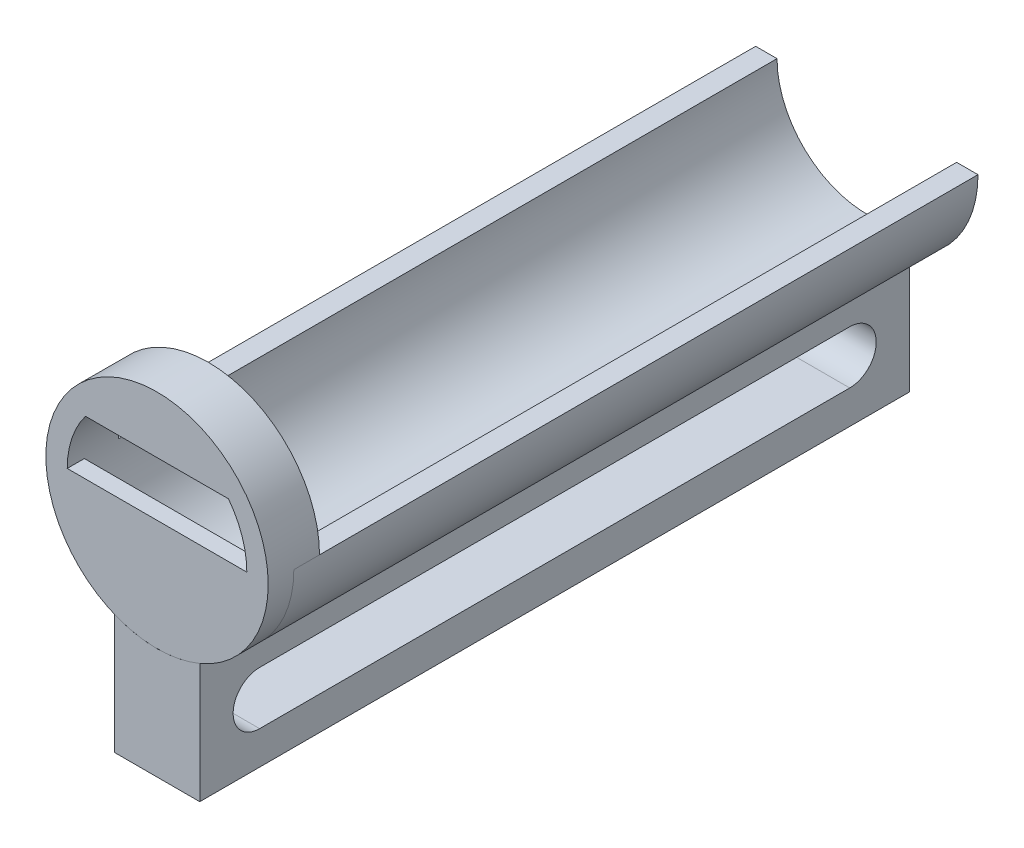
ISO-10303-21;
HEADER;
FILE_DESCRIPTION(('STEP AP214'),'2;1');
FILE_NAME('part.step','',(''),(''),'','','');
FILE_SCHEMA(('AUTOMOTIVE_DESIGN { 1 0 10303 214 1 1 1 1 }'));
ENDSEC;
DATA;
#1=APPLICATION_CONTEXT('core data for automotive mechanical design processes');
#2=APPLICATION_PROTOCOL_DEFINITION('international standard','automotive_design',2000,#1);
#3=PRODUCT_CONTEXT('',#1,'mechanical');
#4=PRODUCT('Part','Part','',(#3));
#5=PRODUCT_RELATED_PRODUCT_CATEGORY('part','',(#4));
#6=PRODUCT_DEFINITION_FORMATION('','',#4);
#7=PRODUCT_DEFINITION_CONTEXT('part definition',#1,'design');
#8=PRODUCT_DEFINITION('design','',#6,#7);
#9=PRODUCT_DEFINITION_SHAPE('','',#8);
#10=(LENGTH_UNIT() NAMED_UNIT(*) SI_UNIT(.MILLI.,.METRE.));
#11=(NAMED_UNIT(*) PLANE_ANGLE_UNIT() SI_UNIT($,.RADIAN.));
#12=(NAMED_UNIT(*) SI_UNIT($,.STERADIAN.) SOLID_ANGLE_UNIT());
#13=UNCERTAINTY_MEASURE_WITH_UNIT(LENGTH_MEASURE(1.E-05),#10,'distance_accuracy_value','');
#14=(GEOMETRIC_REPRESENTATION_CONTEXT(3) GLOBAL_UNCERTAINTY_ASSIGNED_CONTEXT((#13)) GLOBAL_UNIT_ASSIGNED_CONTEXT((#10,
#11,#12)) REPRESENTATION_CONTEXT('',''));
#15=CARTESIAN_POINT('',(0.,0.,0.));
#16=DIRECTION('',(0.,0.,1.));
#17=DIRECTION('',(1.,0.,0.));
#18=AXIS2_PLACEMENT_3D('',#15,#16,#17);
#19=CARTESIAN_POINT('',(8231.96943647304,2967.6134101707,3.));
#20=DIRECTION('',(-1.,0.,0.));
#21=DIRECTION('',(0.,0.,1.));
#22=AXIS2_PLACEMENT_3D('',#19,#20,#21);
#23=PLANE('',#22);
#24=CARTESIAN_POINT('',(8231.96943647304,2974.6134101707,-73.));
#25=DIRECTION('',(-1.,0.,0.));
#26=DIRECTION('',(0.,0.,1.));
#27=AXIS2_PLACEMENT_3D('',#24,#25,#26);
#28=CIRCLE('',#27,3.10000000000032);
#29=CARTESIAN_POINT('',(8231.96943647304,2977.7134101707,-73.));
#30=VERTEX_POINT('',#29);
#31=CARTESIAN_POINT('',(8231.96943647304,2971.5134101707,-73.));
#32=VERTEX_POINT('',#31);
#33=EDGE_CURVE('E80',#30,#32,#28,.T.);
#34=ORIENTED_EDGE('',*,*,#33,.F.);
#35=DIRECTION('',(0.,0.,-1.));
#36=VECTOR('',#35,1.);
#37=CARTESIAN_POINT('',(8231.96943647304,2977.7134101707,-73.));
#38=LINE('',#37,#36);
#39=CARTESIAN_POINT('',(8231.96943647304,2977.7134101707,-4.));
#40=VERTEX_POINT('',#39);
#41=EDGE_CURVE('E167',#40,#30,#38,.T.);
#42=ORIENTED_EDGE('',*,*,#41,.F.);
#43=CARTESIAN_POINT('',(8231.96943647304,2974.6134101707,-4.));
#44=DIRECTION('',(-1.,0.,0.));
#45=DIRECTION('',(0.,0.,1.));
#46=AXIS2_PLACEMENT_3D('',#43,#44,#45);
#47=CIRCLE('',#46,3.10000000000032);
#48=CARTESIAN_POINT('',(8231.96943647304,2971.5134101707,-4.));
#49=VERTEX_POINT('',#48);
#50=EDGE_CURVE('E178',#49,#40,#47,.T.);
#51=ORIENTED_EDGE('',*,*,#50,.F.);
#52=DIRECTION('',(0.,0.,1.));
#53=VECTOR('',#52,1.);
#54=CARTESIAN_POINT('',(8231.96943647304,2971.5134101707,-73.));
#55=LINE('',#54,#53);
#56=EDGE_CURVE('E215',#32,#49,#55,.T.);
#57=ORIENTED_EDGE('',*,*,#56,.F.);
#58=EDGE_LOOP('',(#34,#42,#51,#57));
#59=FACE_BOUND('',#58,.T.);
#60=DIRECTION('',(0.,1.,0.));
#61=VECTOR('',#60,1.);
#62=CARTESIAN_POINT('',(8231.96943647304,2967.6134101707,3.));
#63=LINE('',#62,#61);
#64=CARTESIAN_POINT('',(8231.96943647304,2967.6134101707,3.));
#65=VERTEX_POINT('',#64);
#66=CARTESIAN_POINT('',(8231.96943647304,2981.6134101707,3.));
#67=VERTEX_POINT('',#66);
#68=EDGE_CURVE('E140',#65,#67,#63,.T.);
#69=ORIENTED_EDGE('',*,*,#68,.T.);
#70=DIRECTION('',(0.,0.,1.));
#71=VECTOR('',#70,1.);
#72=CARTESIAN_POINT('',(8231.96943647304,2981.6134101707,-97.));
#73=LINE('',#72,#71);
#74=CARTESIAN_POINT('',(8231.96943647304,2981.6134101707,-80.));
#75=VERTEX_POINT('',#74);
#76=EDGE_CURVE('E73',#67,#75,#73,.F.);
#77=ORIENTED_EDGE('',*,*,#76,.T.);
#78=DIRECTION('',(0.,1.,0.));
#79=VECTOR('',#78,1.);
#80=CARTESIAN_POINT('',(8231.96943647304,2967.6134101707,-80.));
#81=LINE('',#80,#79);
#82=CARTESIAN_POINT('',(8231.96943647304,2967.6134101707,-80.));
#83=VERTEX_POINT('',#82);
#84=EDGE_CURVE('E142',#83,#75,#81,.T.);
#85=ORIENTED_EDGE('',*,*,#84,.F.);
#86=DIRECTION('',(0.,0.,1.));
#87=VECTOR('',#86,1.);
#88=CARTESIAN_POINT('',(8231.96943647304,2967.6134101707,3.));
#89=LINE('',#88,#87);
#90=EDGE_CURVE('E168',#83,#65,#89,.T.);
#91=ORIENTED_EDGE('',*,*,#90,.T.);
#92=EDGE_LOOP('',(#69,#77,#85,#91));
#93=FACE_BOUND('',#92,.T.);
#94=ADVANCED_FACE('F59',(#59,#93),#23,.T.);
#95=CARTESIAN_POINT('',(8241.96943647304,2967.6134101707,3.));
#96=DIRECTION('',(1.,0.,0.));
#97=DIRECTION('',(0.,0.,-1.));
#98=AXIS2_PLACEMENT_3D('',#95,#96,#97);
#99=PLANE('',#98);
#100=CARTESIAN_POINT('',(8241.96943647304,2974.6134101707,-73.));
#101=DIRECTION('',(1.,0.,0.));
#102=DIRECTION('',(0.,0.,-1.));
#103=AXIS2_PLACEMENT_3D('',#100,#101,#102);
#104=CIRCLE('',#103,3.10000000000032);
#105=CARTESIAN_POINT('',(8241.96943647304,2971.5134101707,-73.));
#106=VERTEX_POINT('',#105);
#107=CARTESIAN_POINT('',(8241.96943647304,2977.7134101707,-73.));
#108=VERTEX_POINT('',#107);
#109=EDGE_CURVE('E66',#106,#108,#104,.T.);
#110=ORIENTED_EDGE('',*,*,#109,.F.);
#111=DIRECTION('',(0.,0.,-1.));
#112=VECTOR('',#111,1.);
#113=CARTESIAN_POINT('',(8241.96943647304,2971.5134101707,3.));
#114=LINE('',#113,#112);
#115=CARTESIAN_POINT('',(8241.96943647304,2971.5134101707,-4.));
#116=VERTEX_POINT('',#115);
#117=EDGE_CURVE('E148',#116,#106,#114,.T.);
#118=ORIENTED_EDGE('',*,*,#117,.F.);
#119=CARTESIAN_POINT('',(8241.96943647304,2974.6134101707,-4.));
#120=DIRECTION('',(1.,0.,0.));
#121=DIRECTION('',(0.,0.,-1.));
#122=AXIS2_PLACEMENT_3D('',#119,#120,#121);
#123=CIRCLE('',#122,3.10000000000032);
#124=CARTESIAN_POINT('',(8241.96943647304,2977.7134101707,-4.));
#125=VERTEX_POINT('',#124);
#126=EDGE_CURVE('E150',#125,#116,#123,.T.);
#127=ORIENTED_EDGE('',*,*,#126,.F.);
#128=DIRECTION('',(0.,0.,1.));
#129=VECTOR('',#128,1.);
#130=CARTESIAN_POINT('',(8241.96943647304,2977.7134101707,3.));
#131=LINE('',#130,#129);
#132=EDGE_CURVE('E153',#108,#125,#131,.T.);
#133=ORIENTED_EDGE('',*,*,#132,.F.);
#134=EDGE_LOOP('',(#110,#118,#127,#133));
#135=FACE_BOUND('',#134,.T.);
#136=DIRECTION('',(0.,1.,0.));
#137=VECTOR('',#136,1.);
#138=CARTESIAN_POINT('',(8241.96943647304,2967.6134101707,-80.));
#139=LINE('',#138,#137);
#140=CARTESIAN_POINT('',(8241.96943647304,2967.6134101707,-80.));
#141=VERTEX_POINT('',#140);
#142=CARTESIAN_POINT('',(8241.96943647304,2981.6134101707,-80.));
#143=VERTEX_POINT('',#142);
#144=EDGE_CURVE('E133',#141,#143,#139,.T.);
#145=ORIENTED_EDGE('',*,*,#144,.T.);
#146=DIRECTION('',(0.,0.,1.));
#147=VECTOR('',#146,1.);
#148=CARTESIAN_POINT('',(8241.96943647304,2981.6134101707,-97.));
#149=LINE('',#148,#147);
#150=CARTESIAN_POINT('',(8241.96943647304,2981.6134101707,3.));
#151=VERTEX_POINT('',#150);
#152=EDGE_CURVE('E122',#143,#151,#149,.T.);
#153=ORIENTED_EDGE('',*,*,#152,.T.);
#154=DIRECTION('',(0.,1.,0.));
#155=VECTOR('',#154,1.);
#156=CARTESIAN_POINT('',(8241.96943647304,2967.6134101707,3.));
#157=LINE('',#156,#155);
#158=CARTESIAN_POINT('',(8241.96943647304,2967.6134101707,3.));
#159=VERTEX_POINT('',#158);
#160=EDGE_CURVE('E131',#159,#151,#157,.T.);
#161=ORIENTED_EDGE('',*,*,#160,.F.);
#162=DIRECTION('',(0.,0.,-1.));
#163=VECTOR('',#162,1.);
#164=CARTESIAN_POINT('',(8241.96943647304,2967.6134101707,3.));
#165=LINE('',#164,#163);
#166=EDGE_CURVE('E187',#159,#141,#165,.T.);
#167=ORIENTED_EDGE('',*,*,#166,.T.);
#168=EDGE_LOOP('',(#145,#153,#161,#167));
#169=FACE_BOUND('',#168,.T.);
#170=ADVANCED_FACE('F129',(#135,#169),#99,.T.);
#171=CARTESIAN_POINT('',(8231.96943647304,2967.6134101707,-80.));
#172=DIRECTION('',(0.,0.,-1.));
#173=DIRECTION('',(-1.,0.,0.));
#174=AXIS2_PLACEMENT_3D('',#171,#172,#173);
#175=PLANE('',#174);
#176=ORIENTED_EDGE('',*,*,#84,.T.);
#177=CARTESIAN_POINT('',(8236.96943647304,2993.6134101707,-80.));
#178=DIRECTION('',(0.,0.,-1.));
#179=DIRECTION('',(-1.,0.,0.));
#180=AXIS2_PLACEMENT_3D('',#177,#178,#179);
#181=CIRCLE('',#180,13.0000000000006);
#182=EDGE_CURVE('E134',#75,#143,#181,.F.);
#183=ORIENTED_EDGE('',*,*,#182,.T.);
#184=ORIENTED_EDGE('',*,*,#144,.F.);
#185=DIRECTION('',(-1.,0.,0.));
#186=VECTOR('',#185,1.);
#187=CARTESIAN_POINT('',(8231.96943647304,2967.6134101707,-80.));
#188=LINE('',#187,#186);
#189=EDGE_CURVE('E144',#141,#83,#188,.T.);
#190=ORIENTED_EDGE('',*,*,#189,.T.);
#191=EDGE_LOOP('',(#176,#183,#184,#190));
#192=FACE_BOUND('',#191,.T.);
#193=ADVANCED_FACE('F192',(#192),#175,.T.);
#194=CARTESIAN_POINT('',(8231.96943647304,2967.6134101707,3.));
#195=DIRECTION('',(0.,0.,1.));
#196=DIRECTION('',(1.,0.,0.));
#197=AXIS2_PLACEMENT_3D('',#194,#195,#196);
#198=PLANE('',#197);
#199=ORIENTED_EDGE('',*,*,#160,.T.);
#200=CARTESIAN_POINT('',(8236.96943647304,2993.6134101707,3.));
#201=DIRECTION('',(0.,0.,1.));
#202=DIRECTION('',(1.,0.,0.));
#203=AXIS2_PLACEMENT_3D('',#200,#201,#202);
#204=CIRCLE('',#203,13.0000000000006);
#205=EDGE_CURVE('E12',#151,#67,#204,.F.);
#206=ORIENTED_EDGE('',*,*,#205,.T.);
#207=ORIENTED_EDGE('',*,*,#68,.F.);
#208=DIRECTION('',(1.,0.,0.));
#209=VECTOR('',#208,1.);
#210=CARTESIAN_POINT('',(8231.96943647304,2967.6134101707,3.));
#211=LINE('',#210,#209);
#212=EDGE_CURVE('E139',#65,#159,#211,.T.);
#213=ORIENTED_EDGE('',*,*,#212,.T.);
#214=EDGE_LOOP('',(#199,#206,#207,#213));
#215=FACE_BOUND('',#214,.T.);
#216=ADVANCED_FACE('F137',(#215),#198,.T.);
#217=CARTESIAN_POINT('',(0.,2967.6134101707,0.));
#218=DIRECTION('',(0.,-1.,0.));
#219=DIRECTION('',(0.,0.,-1.));
#220=AXIS2_PLACEMENT_3D('',#217,#218,#219);
#221=PLANE('',#220);
#222=ORIENTED_EDGE('',*,*,#90,.F.);
#223=ORIENTED_EDGE('',*,*,#189,.F.);
#224=ORIENTED_EDGE('',*,*,#166,.F.);
#225=ORIENTED_EDGE('',*,*,#212,.F.);
#226=EDGE_LOOP('',(#222,#223,#224,#225));
#227=FACE_BOUND('',#226,.T.);
#228=ADVANCED_FACE('F197',(#227),#221,.T.);
#229=CARTESIAN_POINT('',(8249.96943647304,2974.6134101707,-73.));
#230=DIRECTION('',(-1.,0.,0.));
#231=DIRECTION('',(0.,0.,1.));
#232=AXIS2_PLACEMENT_3D('',#229,#230,#231);
#233=CYLINDRICAL_SURFACE('',#232,3.10000000000032);
#234=ORIENTED_EDGE('',*,*,#109,.T.);
#235=DIRECTION('',(-1.,0.,0.));
#236=VECTOR('',#235,1.);
#237=CARTESIAN_POINT('',(8249.96943647304,2977.7134101707,-73.));
#238=LINE('',#237,#236);
#239=EDGE_CURVE('E157',#108,#30,#238,.T.);
#240=ORIENTED_EDGE('',*,*,#239,.T.);
#241=ORIENTED_EDGE('',*,*,#33,.T.);
#242=DIRECTION('',(-1.,0.,0.));
#243=VECTOR('',#242,1.);
#244=CARTESIAN_POINT('',(8249.96943647304,2971.5134101707,-73.));
#245=LINE('',#244,#243);
#246=EDGE_CURVE('E159',#106,#32,#245,.T.);
#247=ORIENTED_EDGE('',*,*,#246,.F.);
#248=EDGE_LOOP('',(#234,#240,#241,#247));
#249=FACE_BOUND('',#248,.T.);
#250=ADVANCED_FACE('F156',(#249),#233,.F.);
#251=CARTESIAN_POINT('',(8249.96943647304,2977.7134101707,-73.));
#252=DIRECTION('',(0.,1.,0.));
#253=DIRECTION('',(0.,0.,1.));
#254=AXIS2_PLACEMENT_3D('',#251,#252,#253);
#255=PLANE('',#254);
#256=ORIENTED_EDGE('',*,*,#132,.T.);
#257=DIRECTION('',(-1.,0.,0.));
#258=VECTOR('',#257,1.);
#259=CARTESIAN_POINT('',(8249.96943647304,2977.7134101707,-4.));
#260=LINE('',#259,#258);
#261=EDGE_CURVE('E169',#125,#40,#260,.T.);
#262=ORIENTED_EDGE('',*,*,#261,.T.);
#263=ORIENTED_EDGE('',*,*,#41,.T.);
#264=ORIENTED_EDGE('',*,*,#239,.F.);
#265=EDGE_LOOP('',(#256,#262,#263,#264));
#266=FACE_BOUND('',#265,.T.);
#267=ADVANCED_FACE('F164',(#266),#255,.F.);
#268=CARTESIAN_POINT('',(8249.96943647304,2974.6134101707,-4.));
#269=DIRECTION('',(-1.,0.,0.));
#270=DIRECTION('',(0.,0.,1.));
#271=AXIS2_PLACEMENT_3D('',#268,#269,#270);
#272=CYLINDRICAL_SURFACE('',#271,3.10000000000032);
#273=ORIENTED_EDGE('',*,*,#126,.T.);
#274=DIRECTION('',(-1.,0.,0.));
#275=VECTOR('',#274,1.);
#276=CARTESIAN_POINT('',(8249.96943647304,2971.5134101707,-4.));
#277=LINE('',#276,#275);
#278=EDGE_CURVE('E175',#116,#49,#277,.T.);
#279=ORIENTED_EDGE('',*,*,#278,.T.);
#280=ORIENTED_EDGE('',*,*,#50,.T.);
#281=ORIENTED_EDGE('',*,*,#261,.F.);
#282=EDGE_LOOP('',(#273,#279,#280,#281));
#283=FACE_BOUND('',#282,.T.);
#284=ADVANCED_FACE('F173',(#283),#272,.F.);
#285=CARTESIAN_POINT('',(8249.96943647304,2971.5134101707,-73.));
#286=DIRECTION('',(0.,-1.,0.));
#287=DIRECTION('',(0.,0.,-1.));
#288=AXIS2_PLACEMENT_3D('',#285,#286,#287);
#289=PLANE('',#288);
#290=ORIENTED_EDGE('',*,*,#117,.T.);
#291=ORIENTED_EDGE('',*,*,#246,.T.);
#292=ORIENTED_EDGE('',*,*,#56,.T.);
#293=ORIENTED_EDGE('',*,*,#278,.F.);
#294=EDGE_LOOP('',(#290,#291,#292,#293));
#295=FACE_BOUND('',#294,.T.);
#296=ADVANCED_FACE('F222',(#295),#289,.F.);
#297=CARTESIAN_POINT('',(8236.96943647304,2993.6134101707,-97.));
#298=DIRECTION('',(0.,0.,1.));
#299=DIRECTION('',(1.,0.,0.));
#300=AXIS2_PLACEMENT_3D('',#297,#298,#299);
#301=CYLINDRICAL_SURFACE('',#300,13.0000000000006);
#302=ORIENTED_EDGE('',*,*,#205,.F.);
#303=ORIENTED_EDGE('',*,*,#152,.F.);
#304=ORIENTED_EDGE('',*,*,#182,.F.);
#305=ORIENTED_EDGE('',*,*,#76,.F.);
#306=EDGE_LOOP('',(#302,#303,#304,#305));
#307=FACE_BOUND('',#306,.T.);
#308=ADVANCED_FACE('F121',(#307),#301,.F.);
#309=CLOSED_SHELL('',(#94,#170,#193,#216,#228,#250,#267,#284,#296,#308));
#310=MANIFOLD_SOLID_BREP('B2',#309);
#311=CARTESIAN_POINT('',(8236.96943647304,2993.6134101707,3.));
#312=DIRECTION('',(0.,0.,1.));
#313=DIRECTION('',(1.,0.,0.));
#314=AXIS2_PLACEMENT_3D('',#311,#312,#313);
#315=PLANE('',#314);
#316=CARTESIAN_POINT('',(8236.96943647304,2993.6134101707,3.));
#317=DIRECTION('',(0.,0.,1.));
#318=DIRECTION('',(1.,0.,0.));
#319=AXIS2_PLACEMENT_3D('',#316,#317,#318);
#320=CIRCLE('',#319,13.0000000000006);
#321=CARTESIAN_POINT('',(8249.96943647304,2993.6134101707,3.));
#322=VERTEX_POINT('',#321);
#323=EDGE_CURVE('E57',#322,#322,#320,.T.);
#324=ORIENTED_EDGE('',*,*,#323,.T.);
#325=EDGE_LOOP('',(#324));
#326=FACE_BOUND('',#325,.T.);
#327=CARTESIAN_POINT('',(8236.96943647304,2993.6134101707,3.));
#328=DIRECTION('',(0.,0.,1.));
#329=DIRECTION('',(1.,0.,0.));
#330=AXIS2_PLACEMENT_3D('',#327,#328,#329);
#331=CIRCLE('',#330,10.5000000000006);
#332=CARTESIAN_POINT('',(8247.46943647304,2993.6134101707,3.));
#333=VERTEX_POINT('',#332);
#334=CARTESIAN_POINT('',(8245.33100298067,2999.96433179977,3.));
#335=VERTEX_POINT('',#334);
#336=EDGE_CURVE('E312',#333,#335,#331,.T.);
#337=ORIENTED_EDGE('',*,*,#336,.F.);
#338=DIRECTION('',(-1.,0.,0.));
#339=VECTOR('',#338,1.);
#340=CARTESIAN_POINT('',(8247.46943647304,2993.6134101707,3.));
#341=LINE('',#340,#339);
#342=CARTESIAN_POINT('',(8226.46943647304,2993.6134101707,3.));
#343=VERTEX_POINT('',#342);
#344=EDGE_CURVE('E496',#333,#343,#341,.T.);
#345=ORIENTED_EDGE('',*,*,#344,.T.);
#346=CARTESIAN_POINT('',(8228.60786996541,2999.96433179977,3.));
#347=VERTEX_POINT('',#346);
#348=EDGE_CURVE('E501',#347,#343,#331,.T.);
#349=ORIENTED_EDGE('',*,*,#348,.F.);
#350=DIRECTION('',(1.,0.,0.));
#351=VECTOR('',#350,1.);
#352=CARTESIAN_POINT('',(8228.60786996541,2999.96433179977,3.));
#353=LINE('',#352,#351);
#354=EDGE_CURVE('E498',#347,#335,#353,.T.);
#355=ORIENTED_EDGE('',*,*,#354,.T.);
#356=EDGE_LOOP('',(#337,#345,#349,#355));
#357=FACE_BOUND('',#356,.T.);
#358=ADVANCED_FACE('F300',(#326,#357),#315,.T.);
#359=CARTESIAN_POINT('',(8236.96943647304,2993.6134101707,3.));
#360=DIRECTION('',(0.,0.,-1.));
#361=DIRECTION('',(-1.,0.,0.));
#362=AXIS2_PLACEMENT_3D('',#359,#360,#361);
#363=CYLINDRICAL_SURFACE('',#362,13.0000000000006);
#364=ORIENTED_EDGE('',*,*,#323,.F.);
#365=EDGE_LOOP('',(#364));
#366=FACE_BOUND('',#365,.T.);
#367=CARTESIAN_POINT('',(8236.96943647304,2993.6134101707,0.));
#368=DIRECTION('',(0.,0.,-1.));
#369=DIRECTION('',(1.,0.,0.));
#370=AXIS2_PLACEMENT_3D('',#367,#368,#369);
#371=CIRCLE('',#370,12.9994291002493);
#372=CARTESIAN_POINT('',(8249.96915102316,2993.6134101707,0.));
#373=VERTEX_POINT('',#372);
#374=CARTESIAN_POINT('',(8223.96972192291,2993.6134101707,0.));
#375=VERTEX_POINT('',#374);
#376=EDGE_CURVE('E401',#373,#375,#371,.T.);
#377=ORIENTED_EDGE('',*,*,#376,.F.);
#378=DIRECTION('',(0.,0.,1.));
#379=VECTOR('',#378,1.);
#380=CARTESIAN_POINT('',(8249.96943647304,2993.6134101707,-3.));
#381=LINE('',#380,#379);
#382=CARTESIAN_POINT('',(8249.96943647304,2993.6134101707,-3.));
#383=VERTEX_POINT('',#382);
#384=EDGE_CURVE('E402',#383,#373,#381,.T.);
#385=ORIENTED_EDGE('',*,*,#384,.F.);
#386=CARTESIAN_POINT('',(8236.96943647304,2993.6134101707,-3.));
#387=DIRECTION('',(0.,0.,-1.));
#388=DIRECTION('',(-1.,0.,0.));
#389=AXIS2_PLACEMENT_3D('',#386,#387,#388);
#390=CIRCLE('',#389,12.9999999999999);
#391=CARTESIAN_POINT('',(8223.96943647304,2993.6134101707,-3.));
#392=VERTEX_POINT('',#391);
#393=EDGE_CURVE('E386',#392,#383,#390,.T.);
#394=ORIENTED_EDGE('',*,*,#393,.F.);
#395=DIRECTION('',(0.,0.,1.));
#396=VECTOR('',#395,1.);
#397=CARTESIAN_POINT('',(8223.96943647304,2993.6134101707,-3.));
#398=LINE('',#397,#396);
#399=EDGE_CURVE('E394',#392,#375,#398,.T.);
#400=ORIENTED_EDGE('',*,*,#399,.T.);
#401=EDGE_LOOP('',(#377,#385,#394,#400));
#402=FACE_BOUND('',#401,.T.);
#403=ADVANCED_FACE('F302',(#366,#402),#363,.T.);
#404=CARTESIAN_POINT('',(8236.96943647304,2993.6134101707,3.));
#405=DIRECTION('',(0.,0.,-1.));
#406=DIRECTION('',(-1.,0.,0.));
#407=AXIS2_PLACEMENT_3D('',#404,#405,#406);
#408=CYLINDRICAL_SURFACE('',#407,10.5000000000006);
#409=DIRECTION('',(0.,0.,1.));
#410=VECTOR('',#409,1.);
#411=CARTESIAN_POINT('',(8247.46943647304,2993.6134101707,1.));
#412=LINE('',#411,#410);
#413=CARTESIAN_POINT('',(8247.46943647304,2993.6134101707,1.));
#414=VERTEX_POINT('',#413);
#415=EDGE_CURVE('E503',#414,#333,#412,.T.);
#416=ORIENTED_EDGE('',*,*,#415,.T.);
#417=ORIENTED_EDGE('',*,*,#336,.T.);
#418=DIRECTION('',(0.,0.,1.));
#419=VECTOR('',#418,1.);
#420=CARTESIAN_POINT('',(8245.33100298067,2999.96433179977,1.));
#421=LINE('',#420,#419);
#422=CARTESIAN_POINT('',(8245.33100298067,2999.96433179977,1.));
#423=VERTEX_POINT('',#422);
#424=EDGE_CURVE('E442',#423,#335,#421,.T.);
#425=ORIENTED_EDGE('',*,*,#424,.F.);
#426=CARTESIAN_POINT('',(8236.96943647304,2993.6134101707,1.));
#427=DIRECTION('',(0.,0.,1.));
#428=DIRECTION('',(1.,0.,0.));
#429=AXIS2_PLACEMENT_3D('',#426,#427,#428);
#430=CIRCLE('',#429,10.5000000000004);
#431=CARTESIAN_POINT('',(8228.60786996541,2999.96433179977,1.));
#432=VERTEX_POINT('',#431);
#433=EDGE_CURVE('E517',#423,#432,#430,.T.);
#434=ORIENTED_EDGE('',*,*,#433,.T.);
#435=DIRECTION('',(0.,0.,1.));
#436=VECTOR('',#435,1.);
#437=CARTESIAN_POINT('',(8228.60786996541,2999.96433179977,1.));
#438=LINE('',#437,#436);
#439=EDGE_CURVE('E523',#432,#347,#438,.T.);
#440=ORIENTED_EDGE('',*,*,#439,.T.);
#441=ORIENTED_EDGE('',*,*,#348,.T.);
#442=DIRECTION('',(0.,0.,1.));
#443=VECTOR('',#442,1.);
#444=CARTESIAN_POINT('',(8226.46943647304,2993.6134101707,1.));
#445=LINE('',#444,#443);
#446=CARTESIAN_POINT('',(8226.46943647304,2993.6134101707,1.));
#447=VERTEX_POINT('',#446);
#448=EDGE_CURVE('E508',#447,#343,#445,.T.);
#449=ORIENTED_EDGE('',*,*,#448,.F.);
#450=CARTESIAN_POINT('',(8236.96943647304,2993.6134101707,1.));
#451=DIRECTION('',(0.,0.,1.));
#452=DIRECTION('',(1.,0.,0.));
#453=AXIS2_PLACEMENT_3D('',#450,#451,#452);
#454=CIRCLE('',#453,10.5000000000004);
#455=EDGE_CURVE('E328',#447,#414,#454,.T.);
#456=ORIENTED_EDGE('',*,*,#455,.T.);
#457=EDGE_LOOP('',(#416,#417,#425,#434,#440,#441,#449,#456));
#458=FACE_BOUND('',#457,.T.);
#459=CARTESIAN_POINT('',(8236.96943647304,2993.6134101707,-3.));
#460=DIRECTION('',(0.,0.,1.));
#461=DIRECTION('',(-1.,0.,0.));
#462=AXIS2_PLACEMENT_3D('',#459,#460,#461);
#463=CIRCLE('',#462,10.5000000000004);
#464=CARTESIAN_POINT('',(8247.46943647304,2993.6134101707,-3.));
#465=VERTEX_POINT('',#464);
#466=CARTESIAN_POINT('',(8226.46943647304,2993.6134101707,-3.));
#467=VERTEX_POINT('',#466);
#468=EDGE_CURVE('E320',#465,#467,#463,.T.);
#469=ORIENTED_EDGE('',*,*,#468,.F.);
#470=DIRECTION('',(0.,0.,1.));
#471=VECTOR('',#470,1.);
#472=CARTESIAN_POINT('',(8247.46943647304,2993.6134101707,-80.));
#473=LINE('',#472,#471);
#474=CARTESIAN_POINT('',(8247.46943647304,2993.6134101707,-80.));
#475=VERTEX_POINT('',#474);
#476=EDGE_CURVE('E438',#475,#465,#473,.T.);
#477=ORIENTED_EDGE('',*,*,#476,.F.);
#478=CARTESIAN_POINT('',(8236.96943647304,2993.6134101707,-80.));
#479=DIRECTION('',(0.,0.,1.));
#480=DIRECTION('',(-1.,0.,0.));
#481=AXIS2_PLACEMENT_3D('',#478,#479,#480);
#482=CIRCLE('',#481,10.5000000000004);
#483=CARTESIAN_POINT('',(8226.46943647304,2993.6134101707,-80.));
#484=VERTEX_POINT('',#483);
#485=EDGE_CURVE('E421',#484,#475,#482,.T.);
#486=ORIENTED_EDGE('',*,*,#485,.F.);
#487=DIRECTION('',(0.,0.,1.));
#488=VECTOR('',#487,1.);
#489=CARTESIAN_POINT('',(8226.46943647304,2993.6134101707,-80.));
#490=LINE('',#489,#488);
#491=EDGE_CURVE('E434',#484,#467,#490,.T.);
#492=ORIENTED_EDGE('',*,*,#491,.T.);
#493=EDGE_LOOP('',(#469,#477,#486,#492));
#494=FACE_BOUND('',#493,.T.);
#495=ADVANCED_FACE('F479',(#458,#494),#408,.F.);
#496=CARTESIAN_POINT('',(8228.60786996541,2999.96433179977,1.));
#497=DIRECTION('',(0.,-1.,0.));
#498=DIRECTION('',(1.,0.,0.));
#499=AXIS2_PLACEMENT_3D('',#496,#497,#498);
#500=PLANE('',#499);
#501=ORIENTED_EDGE('',*,*,#354,.F.);
#502=ORIENTED_EDGE('',*,*,#439,.F.);
#503=DIRECTION('',(1.,0.,0.));
#504=VECTOR('',#503,1.);
#505=CARTESIAN_POINT('',(8228.60786996541,2999.96433179977,1.));
#506=LINE('',#505,#504);
#507=EDGE_CURVE('E527',#432,#423,#506,.T.);
#508=ORIENTED_EDGE('',*,*,#507,.T.);
#509=ORIENTED_EDGE('',*,*,#424,.T.);
#510=EDGE_LOOP('',(#501,#502,#508,#509));
#511=FACE_BOUND('',#510,.T.);
#512=ADVANCED_FACE('F476',(#511),#500,.T.);
#513=CARTESIAN_POINT('',(8236.96943647304,2993.6134101707,1.));
#514=DIRECTION('',(0.,0.,1.));
#515=DIRECTION('',(1.,0.,0.));
#516=AXIS2_PLACEMENT_3D('',#513,#514,#515);
#517=PLANE('',#516);
#518=ORIENTED_EDGE('',*,*,#433,.F.);
#519=ORIENTED_EDGE('',*,*,#507,.F.);
#520=EDGE_LOOP('',(#518,#519));
#521=FACE_BOUND('',#520,.T.);
#522=ADVANCED_FACE('F474',(#521),#517,.F.);
#523=CARTESIAN_POINT('',(8247.46943647304,2993.6134101707,1.));
#524=DIRECTION('',(0.,1.,0.));
#525=DIRECTION('',(0.,0.,1.));
#526=AXIS2_PLACEMENT_3D('',#523,#524,#525);
#527=PLANE('',#526);
#528=ORIENTED_EDGE('',*,*,#344,.F.);
#529=ORIENTED_EDGE('',*,*,#415,.F.);
#530=DIRECTION('',(-1.,0.,0.));
#531=VECTOR('',#530,1.);
#532=CARTESIAN_POINT('',(8247.46943647304,2993.6134101707,1.));
#533=LINE('',#532,#531);
#534=EDGE_CURVE('E509',#414,#447,#533,.T.);
#535=ORIENTED_EDGE('',*,*,#534,.T.);
#536=ORIENTED_EDGE('',*,*,#448,.T.);
#537=EDGE_LOOP('',(#528,#529,#535,#536));
#538=FACE_BOUND('',#537,.T.);
#539=ADVANCED_FACE('F470',(#538),#527,.T.);
#540=CARTESIAN_POINT('',(8236.96943647304,2993.6134101707,1.));
#541=DIRECTION('',(0.,0.,1.));
#542=DIRECTION('',(1.,0.,0.));
#543=AXIS2_PLACEMENT_3D('',#540,#541,#542);
#544=PLANE('',#543);
#545=ORIENTED_EDGE('',*,*,#455,.F.);
#546=ORIENTED_EDGE('',*,*,#534,.F.);
#547=EDGE_LOOP('',(#545,#546));
#548=FACE_BOUND('',#547,.T.);
#549=ADVANCED_FACE('F466',(#548),#544,.F.);
#550=CARTESIAN_POINT('',(8247.46943647304,2993.6134101707,-80.));
#551=DIRECTION('',(0.,-1.,0.));
#552=DIRECTION('',(0.,0.,-1.));
#553=AXIS2_PLACEMENT_3D('',#550,#551,#552);
#554=PLANE('',#553);
#555=ORIENTED_EDGE('',*,*,#476,.T.);
#556=DIRECTION('',(-1.,0.,0.));
#557=VECTOR('',#556,1.);
#558=CARTESIAN_POINT('',(8249.96943647304,2993.6134101707,-3.));
#559=LINE('',#558,#557);
#560=CARTESIAN_POINT('',(8249.96886557329,2993.6134101707,-3.));
#561=VERTEX_POINT('',#560);
#562=EDGE_CURVE('E406',#561,#465,#559,.T.);
#563=ORIENTED_EDGE('',*,*,#562,.F.);
#564=DIRECTION('',(0.,0.,1.));
#565=VECTOR('',#564,1.);
#566=CARTESIAN_POINT('',(8249.96886557329,2993.6134101707,-80.));
#567=LINE('',#566,#565);
#568=CARTESIAN_POINT('',(8249.96886557329,2993.6134101707,-80.));
#569=VERTEX_POINT('',#568);
#570=EDGE_CURVE('E443',#569,#561,#567,.T.);
#571=ORIENTED_EDGE('',*,*,#570,.F.);
#572=DIRECTION('',(1.,0.,0.));
#573=VECTOR('',#572,1.);
#574=CARTESIAN_POINT('',(8247.46943647304,2993.6134101707,-80.));
#575=LINE('',#574,#573);
#576=EDGE_CURVE('E425',#475,#569,#575,.T.);
#577=ORIENTED_EDGE('',*,*,#576,.F.);
#578=EDGE_LOOP('',(#555,#563,#571,#577));
#579=FACE_BOUND('',#578,.T.);
#580=ADVANCED_FACE('F462',(#579),#554,.F.);
#581=CARTESIAN_POINT('',(8236.96943647304,2993.6134101707,-80.));
#582=DIRECTION('',(0.,0.,1.));
#583=DIRECTION('',(1.,0.,0.));
#584=AXIS2_PLACEMENT_3D('',#581,#582,#583);
#585=CYLINDRICAL_SURFACE('',#584,12.9994291002493);
#586=ORIENTED_EDGE('',*,*,#376,.T.);
#587=DIRECTION('',(0.,0.,1.));
#588=VECTOR('',#587,1.);
#589=CARTESIAN_POINT('',(8223.97000737279,2993.6134101707,-80.));
#590=LINE('',#589,#588);
#591=CARTESIAN_POINT('',(8223.97000737279,2993.6134101707,-3.));
#592=VERTEX_POINT('',#591);
#593=EDGE_CURVE('E396',#592,#375,#590,.T.);
#594=ORIENTED_EDGE('',*,*,#593,.F.);
#595=CARTESIAN_POINT('',(8223.97000737279,2993.6134101707,-80.));
#596=VERTEX_POINT('',#595);
#597=EDGE_CURVE('E545',#596,#592,#590,.T.);
#598=ORIENTED_EDGE('',*,*,#597,.F.);
#599=CARTESIAN_POINT('',(8236.96943647304,2993.6134101707,-80.));
#600=DIRECTION('',(0.,0.,-1.));
#601=DIRECTION('',(-1.,0.,0.));
#602=AXIS2_PLACEMENT_3D('',#599,#600,#601);
#603=CIRCLE('',#602,12.9994291002493);
#604=EDGE_CURVE('E428',#569,#596,#603,.T.);
#605=ORIENTED_EDGE('',*,*,#604,.F.);
#606=ORIENTED_EDGE('',*,*,#570,.T.);
#607=EDGE_CURVE('E305',#561,#373,#567,.T.);
#608=ORIENTED_EDGE('',*,*,#607,.T.);
#609=EDGE_LOOP('',(#586,#594,#598,#605,#606,#608));
#610=FACE_BOUND('',#609,.T.);
#611=ADVANCED_FACE('F451',(#610),#585,.T.);
#612=CARTESIAN_POINT('',(8226.46943647304,2993.6134101707,-80.));
#613=DIRECTION('',(0.,-1.,0.));
#614=DIRECTION('',(0.,0.,-1.));
#615=AXIS2_PLACEMENT_3D('',#612,#613,#614);
#616=PLANE('',#615);
#617=ORIENTED_EDGE('',*,*,#597,.T.);
#618=DIRECTION('',(-1.,0.,0.));
#619=VECTOR('',#618,1.);
#620=CARTESIAN_POINT('',(8226.46943647304,2993.6134101707,-3.));
#621=LINE('',#620,#619);
#622=EDGE_CURVE('E388',#467,#592,#621,.T.);
#623=ORIENTED_EDGE('',*,*,#622,.F.);
#624=ORIENTED_EDGE('',*,*,#491,.F.);
#625=DIRECTION('',(1.,0.,0.));
#626=VECTOR('',#625,1.);
#627=CARTESIAN_POINT('',(8226.46943647304,2993.6134101707,-80.));
#628=LINE('',#627,#626);
#629=EDGE_CURVE('E431',#596,#484,#628,.T.);
#630=ORIENTED_EDGE('',*,*,#629,.F.);
#631=EDGE_LOOP('',(#617,#623,#624,#630));
#632=FACE_BOUND('',#631,.T.);
#633=ADVANCED_FACE('F461',(#632),#616,.F.);
#634=CARTESIAN_POINT('',(8236.96943647304,2993.6134101707,-80.));
#635=DIRECTION('',(0.,0.,-1.));
#636=DIRECTION('',(-1.,0.,0.));
#637=AXIS2_PLACEMENT_3D('',#634,#635,#636);
#638=PLANE('',#637);
#639=ORIENTED_EDGE('',*,*,#485,.T.);
#640=ORIENTED_EDGE('',*,*,#576,.T.);
#641=ORIENTED_EDGE('',*,*,#604,.T.);
#642=ORIENTED_EDGE('',*,*,#629,.T.);
#643=EDGE_LOOP('',(#639,#640,#641,#642));
#644=FACE_BOUND('',#643,.T.);
#645=ADVANCED_FACE('F567',(#644),#638,.T.);
#646=CARTESIAN_POINT('',(8226.46943647304,2993.6134101707,-3.));
#647=DIRECTION('',(0.,1.,0.));
#648=DIRECTION('',(0.,0.,1.));
#649=AXIS2_PLACEMENT_3D('',#646,#647,#648);
#650=PLANE('',#649);
#651=EDGE_CURVE('E381',#592,#392,#621,.T.);
#652=ORIENTED_EDGE('',*,*,#651,.F.);
#653=ORIENTED_EDGE('',*,*,#593,.T.);
#654=ORIENTED_EDGE('',*,*,#399,.F.);
#655=EDGE_LOOP('',(#652,#653,#654));
#656=FACE_BOUND('',#655,.T.);
#657=ADVANCED_FACE('F395',(#656),#650,.F.);
#658=CARTESIAN_POINT('',(8249.96943647304,2993.6134101707,-3.));
#659=DIRECTION('',(0.,1.,0.));
#660=DIRECTION('',(0.,0.,1.));
#661=AXIS2_PLACEMENT_3D('',#658,#659,#660);
#662=PLANE('',#661);
#663=ORIENTED_EDGE('',*,*,#384,.T.);
#664=ORIENTED_EDGE('',*,*,#607,.F.);
#665=EDGE_CURVE('E410',#383,#561,#559,.T.);
#666=ORIENTED_EDGE('',*,*,#665,.F.);
#667=EDGE_LOOP('',(#663,#664,#666));
#668=FACE_BOUND('',#667,.T.);
#669=ADVANCED_FACE('F572',(#668),#662,.F.);
#670=CARTESIAN_POINT('',(8236.96943647304,2993.6134101707,-3.));
#671=DIRECTION('',(0.,0.,-1.));
#672=DIRECTION('',(-1.,0.,0.));
#673=AXIS2_PLACEMENT_3D('',#670,#671,#672);
#674=PLANE('',#673);
#675=ORIENTED_EDGE('',*,*,#468,.T.);
#676=ORIENTED_EDGE('',*,*,#622,.T.);
#677=ORIENTED_EDGE('',*,*,#651,.T.);
#678=ORIENTED_EDGE('',*,*,#393,.T.);
#679=ORIENTED_EDGE('',*,*,#665,.T.);
#680=ORIENTED_EDGE('',*,*,#562,.T.);
#681=EDGE_LOOP('',(#675,#676,#677,#678,#679,#680));
#682=FACE_BOUND('',#681,.T.);
#683=ADVANCED_FACE('F383',(#682),#674,.T.);
#684=CLOSED_SHELL('',(#358,#403,#495,#512,#522,#539,#549,#580,#611,#633,#645,#657,#669,#683));
#685=MANIFOLD_SOLID_BREP('B6',#684);
#686=ADVANCED_BREP_SHAPE_REPRESENTATION('',(#18,#310,#685),#14);
#687=SHAPE_DEFINITION_REPRESENTATION(#9,#686);
ENDSEC;
END-ISO-10303-21;
